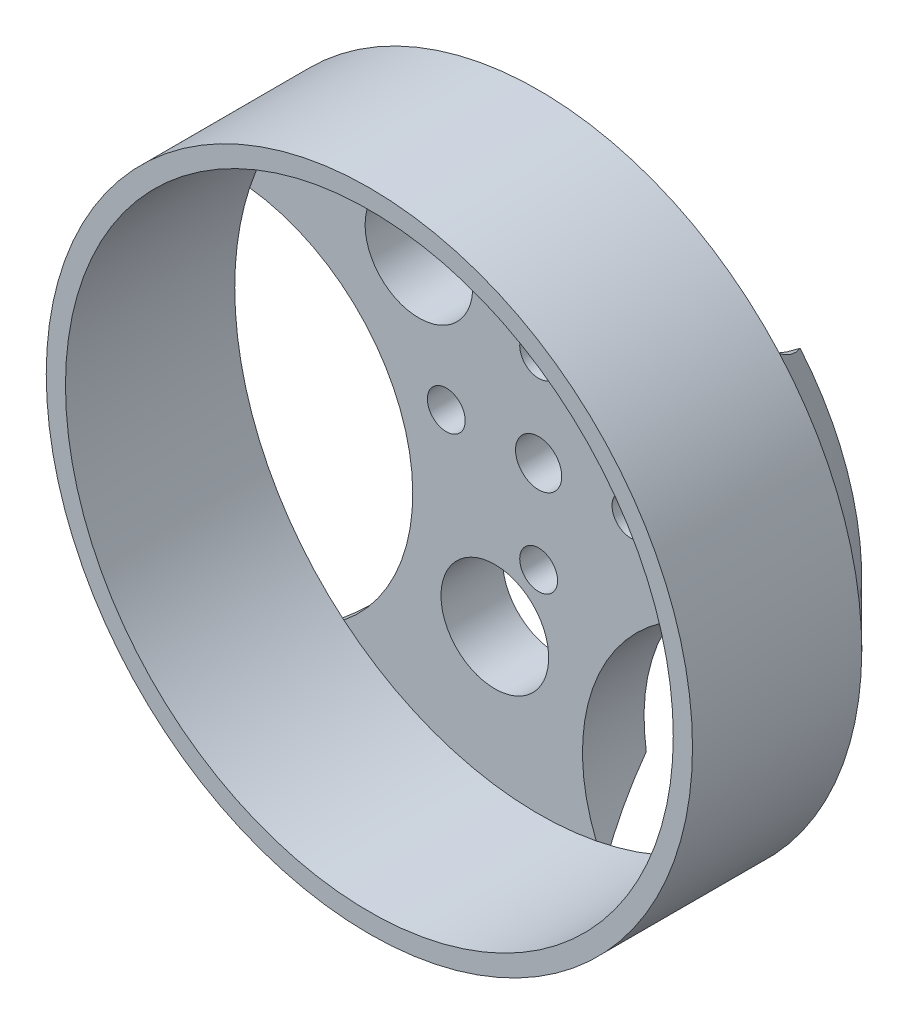
ISO-10303-21;
HEADER;
FILE_DESCRIPTION(('STEP AP214'),'2;1');
FILE_NAME('part.step','',(''),(''),'','','');
FILE_SCHEMA(('AUTOMOTIVE_DESIGN { 1 0 10303 214 1 1 1 1 }'));
ENDSEC;
DATA;
#1=APPLICATION_CONTEXT('core data for automotive mechanical design processes');
#2=APPLICATION_PROTOCOL_DEFINITION('international standard','automotive_design',2000,#1);
#3=PRODUCT_CONTEXT('',#1,'mechanical');
#4=PRODUCT('Part','Part','',(#3));
#5=PRODUCT_RELATED_PRODUCT_CATEGORY('part','',(#4));
#6=PRODUCT_DEFINITION_FORMATION('','',#4);
#7=PRODUCT_DEFINITION_CONTEXT('part definition',#1,'design');
#8=PRODUCT_DEFINITION('design','',#6,#7);
#9=PRODUCT_DEFINITION_SHAPE('','',#8);
#10=(LENGTH_UNIT() NAMED_UNIT(*) SI_UNIT(.MILLI.,.METRE.));
#11=(NAMED_UNIT(*) PLANE_ANGLE_UNIT() SI_UNIT($,.RADIAN.));
#12=(NAMED_UNIT(*) SI_UNIT($,.STERADIAN.) SOLID_ANGLE_UNIT());
#13=UNCERTAINTY_MEASURE_WITH_UNIT(LENGTH_MEASURE(1.E-05),#10,'distance_accuracy_value','');
#14=(GEOMETRIC_REPRESENTATION_CONTEXT(3) GLOBAL_UNCERTAINTY_ASSIGNED_CONTEXT((#13)) GLOBAL_UNIT_ASSIGNED_CONTEXT((#10,
#11,#12)) REPRESENTATION_CONTEXT('',''));
#15=CARTESIAN_POINT('',(0.,0.,0.));
#16=DIRECTION('',(0.,0.,1.));
#17=DIRECTION('',(1.,0.,0.));
#18=AXIS2_PLACEMENT_3D('',#15,#16,#17);
#19=CARTESIAN_POINT('',(164.009459929821,242.498442091416,-11.));
#20=DIRECTION('',(0.,0.,-1.));
#21=DIRECTION('',(-1.,0.,0.));
#22=AXIS2_PLACEMENT_3D('',#19,#20,#21);
#23=PLANE('',#22);
#24=CARTESIAN_POINT('',(164.009459929821,242.498442091416,-11.));
#25=DIRECTION('',(0.,0.,-1.));
#26=DIRECTION('',(-1.,0.,0.));
#27=AXIS2_PLACEMENT_3D('',#24,#25,#26);
#28=CIRCLE('',#27,19.75);
#29=CARTESIAN_POINT('',(151.35141012767,227.338090010866,-11.));
#30=VERTEX_POINT('',#29);
#31=CARTESIAN_POINT('',(167.751872438551,223.106256845434,-11.));
#32=VERTEX_POINT('',#31);
#33=EDGE_CURVE('E92',#30,#32,#28,.F.);
#34=ORIENTED_EDGE('',*,*,#33,.T.);
#35=CARTESIAN_POINT('',(178.858702334738,227.649199686498,-11.));
#36=DIRECTION('',(0.,0.,1.));
#37=DIRECTION('',(1.,0.,0.));
#38=AXIS2_PLACEMENT_3D('',#35,#36,#37);
#39=CIRCLE('',#38,12.);
#40=CARTESIAN_POINT('',(183.401645175803,238.756029582685,-11.));
#41=VERTEX_POINT('',#40);
#42=EDGE_CURVE('E239',#32,#41,#39,.F.);
#43=ORIENTED_EDGE('',*,*,#42,.T.);
#44=CARTESIAN_POINT('',(164.009459929821,242.498442091416,-11.));
#45=DIRECTION('',(0.,0.,-1.));
#46=DIRECTION('',(-1.,0.,0.));
#47=AXIS2_PLACEMENT_3D('',#44,#45,#46);
#48=CIRCLE('',#47,19.75);
#49=CARTESIAN_POINT('',(178.93237873337,255.435559018409,-11.));
#50=VERTEX_POINT('',#49);
#51=EDGE_CURVE('E116',#41,#50,#48,.F.);
#52=ORIENTED_EDGE('',*,*,#51,.T.);
#53=CARTESIAN_POINT('',(169.444659876974,262.782884443487,-11.));
#54=DIRECTION('',(0.,0.,1.));
#55=DIRECTION('',(1.,0.,0.));
#56=AXIS2_PLACEMENT_3D('',#53,#54,#55);
#57=CIRCLE('',#56,12.);
#58=CARTESIAN_POINT('',(157.554391610831,261.163773403696,-11.));
#59=VERTEX_POINT('',#58);
#60=EDGE_CURVE('E244',#50,#59,#57,.F.);
#61=ORIENTED_EDGE('',*,*,#60,.T.);
#62=CARTESIAN_POINT('',(164.009459929821,242.498442091416,-11.));
#63=DIRECTION('',(0.,0.,-1.));
#64=DIRECTION('',(-1.,0.,0.));
#65=AXIS2_PLACEMENT_3D('',#62,#63,#64);
#66=CIRCLE('',#65,19.75);
#67=CARTESIAN_POINT('',(145.227590332982,248.606131871305,-11.));
#68=VERTEX_POINT('',#67);
#69=EDGE_CURVE('E85',#59,#68,#66,.F.);
#70=ORIENTED_EDGE('',*,*,#69,.T.);
#71=CARTESIAN_POINT('',(143.829338827367,236.687873075363,-11.));
#72=DIRECTION('',(0.,0.,1.));
#73=DIRECTION('',(1.,0.,0.));
#74=AXIS2_PLACEMENT_3D('',#71,#72,#73);
#75=CIRCLE('',#74,12.);
#76=EDGE_CURVE('E88',#68,#30,#75,.F.);
#77=ORIENTED_EDGE('',*,*,#76,.T.);
#78=EDGE_LOOP('',(#34,#43,#52,#61,#70,#77));
#79=FACE_BOUND('',#78,.T.);
#80=CARTESIAN_POINT('',(164.009459929821,242.498442091416,-11.));
#81=DIRECTION('',(0.,0.,-1.));
#82=DIRECTION('',(-1.,0.,0.));
#83=AXIS2_PLACEMENT_3D('',#80,#81,#82);
#84=CIRCLE('',#83,1.5);
#85=CARTESIAN_POINT('',(162.509459929821,242.498442091416,-11.));
#86=VERTEX_POINT('',#85);
#87=EDGE_CURVE('E96',#86,#86,#84,.T.);
#88=ORIENTED_EDGE('',*,*,#87,.T.);
#89=EDGE_LOOP('',(#88));
#90=FACE_BOUND('',#89,.T.);
#91=CARTESIAN_POINT('',(156.231285336769,250.276616684468,-11.));
#92=DIRECTION('',(0.,0.,-1.));
#93=DIRECTION('',(-1.,0.,0.));
#94=AXIS2_PLACEMENT_3D('',#91,#92,#93);
#95=CIRCLE('',#94,3.5);
#96=CARTESIAN_POINT('',(152.731285336769,250.276616684468,-11.));
#97=VERTEX_POINT('',#96);
#98=EDGE_CURVE('E252',#97,#97,#95,.T.);
#99=ORIENTED_EDGE('',*,*,#98,.T.);
#100=EDGE_LOOP('',(#99));
#101=FACE_BOUND('',#100,.T.);
#102=CARTESIAN_POINT('',(174.634644019,245.345451587544,-11.));
#103=DIRECTION('',(0.,0.,-1.));
#104=DIRECTION('',(-1.,0.,0.));
#105=AXIS2_PLACEMENT_3D('',#102,#103,#104);
#106=CIRCLE('',#105,3.5);
#107=CARTESIAN_POINT('',(171.134644019,245.345451587544,-11.));
#108=VERTEX_POINT('',#107);
#109=EDGE_CURVE('E255',#108,#108,#106,.T.);
#110=ORIENTED_EDGE('',*,*,#109,.T.);
#111=EDGE_LOOP('',(#110));
#112=FACE_BOUND('',#111,.T.);
#113=CARTESIAN_POINT('',(161.162450433693,231.873258002237,-11.));
#114=DIRECTION('',(0.,0.,-1.));
#115=DIRECTION('',(-1.,0.,0.));
#116=AXIS2_PLACEMENT_3D('',#113,#114,#115);
#117=CIRCLE('',#116,3.5);
#118=CARTESIAN_POINT('',(157.662450433693,231.873258002237,-11.));
#119=VERTEX_POINT('',#118);
#120=EDGE_CURVE('E258',#119,#119,#117,.T.);
#121=ORIENTED_EDGE('',*,*,#120,.T.);
#122=EDGE_LOOP('',(#121));
#123=FACE_BOUND('',#122,.T.);
#124=CARTESIAN_POINT('',(164.009459929821,236.498442091416,-11.));
#125=DIRECTION('',(0.,0.,-1.));
#126=DIRECTION('',(-1.,0.,0.));
#127=AXIS2_PLACEMENT_3D('',#124,#125,#126);
#128=CIRCLE('',#127,1.2295);
#129=CARTESIAN_POINT('',(162.779959929821,236.498442091416,-11.));
#130=VERTEX_POINT('',#129);
#131=EDGE_CURVE('E261',#130,#130,#128,.T.);
#132=ORIENTED_EDGE('',*,*,#131,.T.);
#133=EDGE_LOOP('',(#132));
#134=FACE_BOUND('',#133,.T.);
#135=CARTESIAN_POINT('',(158.009459929821,242.498442091416,-11.));
#136=DIRECTION('',(0.,0.,-1.));
#137=DIRECTION('',(-1.,0.,0.));
#138=AXIS2_PLACEMENT_3D('',#135,#136,#137);
#139=CIRCLE('',#138,1.2295);
#140=CARTESIAN_POINT('',(156.779959929821,242.498442091416,-11.));
#141=VERTEX_POINT('',#140);
#142=EDGE_CURVE('E264',#141,#141,#139,.T.);
#143=ORIENTED_EDGE('',*,*,#142,.T.);
#144=EDGE_LOOP('',(#143));
#145=FACE_BOUND('',#144,.T.);
#146=CARTESIAN_POINT('',(164.009459929821,248.498442091416,-11.));
#147=DIRECTION('',(0.,0.,-1.));
#148=DIRECTION('',(-1.,0.,0.));
#149=AXIS2_PLACEMENT_3D('',#146,#147,#148);
#150=CIRCLE('',#149,1.2295);
#151=CARTESIAN_POINT('',(162.779959929821,248.498442091416,-11.));
#152=VERTEX_POINT('',#151);
#153=EDGE_CURVE('E266',#152,#152,#150,.T.);
#154=ORIENTED_EDGE('',*,*,#153,.T.);
#155=EDGE_LOOP('',(#154));
#156=FACE_BOUND('',#155,.T.);
#157=CARTESIAN_POINT('',(170.009459929821,242.498442091416,-11.));
#158=DIRECTION('',(0.,0.,-1.));
#159=DIRECTION('',(-1.,0.,0.));
#160=AXIS2_PLACEMENT_3D('',#157,#158,#159);
#161=CIRCLE('',#160,1.2295);
#162=CARTESIAN_POINT('',(168.779959929821,242.498442091416,-11.));
#163=VERTEX_POINT('',#162);
#164=EDGE_CURVE('E20',#163,#163,#161,.T.);
#165=ORIENTED_EDGE('',*,*,#164,.T.);
#166=EDGE_LOOP('',(#165));
#167=FACE_BOUND('',#166,.T.);
#168=ADVANCED_FACE('F17',(#79,#90,#101,#112,#123,#134,#145,#156,#167),#23,.F.);
#169=CARTESIAN_POINT('',(170.009459929821,242.498442091416,-15.));
#170=DIRECTION('',(0.,0.,-1.));
#171=DIRECTION('',(-1.,0.,0.));
#172=AXIS2_PLACEMENT_3D('',#169,#170,#171);
#173=CYLINDRICAL_SURFACE('',#172,1.2295);
#174=ORIENTED_EDGE('',*,*,#164,.F.);
#175=EDGE_LOOP('',(#174));
#176=FACE_BOUND('',#175,.T.);
#177=CARTESIAN_POINT('',(170.009459929821,242.498442091416,-15.));
#178=DIRECTION('',(0.,0.,-1.));
#179=DIRECTION('',(-1.,0.,0.));
#180=AXIS2_PLACEMENT_3D('',#177,#178,#179);
#181=CIRCLE('',#180,1.2295);
#182=CARTESIAN_POINT('',(168.779959929821,242.498442091416,-15.));
#183=VERTEX_POINT('',#182);
#184=EDGE_CURVE('E280',#183,#183,#181,.F.);
#185=ORIENTED_EDGE('',*,*,#184,.F.);
#186=EDGE_LOOP('',(#185));
#187=FACE_BOUND('',#186,.T.);
#188=ADVANCED_FACE('F274',(#176,#187),#173,.F.);
#189=CARTESIAN_POINT('',(164.009459929821,248.498442091416,-15.));
#190=DIRECTION('',(0.,0.,-1.));
#191=DIRECTION('',(-1.,0.,0.));
#192=AXIS2_PLACEMENT_3D('',#189,#190,#191);
#193=CYLINDRICAL_SURFACE('',#192,1.2295);
#194=ORIENTED_EDGE('',*,*,#153,.F.);
#195=EDGE_LOOP('',(#194));
#196=FACE_BOUND('',#195,.T.);
#197=CARTESIAN_POINT('',(164.009459929821,248.498442091416,-15.));
#198=DIRECTION('',(0.,0.,-1.));
#199=DIRECTION('',(-1.,0.,0.));
#200=AXIS2_PLACEMENT_3D('',#197,#198,#199);
#201=CIRCLE('',#200,1.2295);
#202=CARTESIAN_POINT('',(162.779959929821,248.498442091416,-15.));
#203=VERTEX_POINT('',#202);
#204=EDGE_CURVE('E282',#203,#203,#201,.F.);
#205=ORIENTED_EDGE('',*,*,#204,.F.);
#206=EDGE_LOOP('',(#205));
#207=FACE_BOUND('',#206,.T.);
#208=ADVANCED_FACE('F277',(#196,#207),#193,.F.);
#209=CARTESIAN_POINT('',(158.009459929821,242.498442091416,-15.));
#210=DIRECTION('',(0.,0.,-1.));
#211=DIRECTION('',(-1.,0.,0.));
#212=AXIS2_PLACEMENT_3D('',#209,#210,#211);
#213=CYLINDRICAL_SURFACE('',#212,1.2295);
#214=ORIENTED_EDGE('',*,*,#142,.F.);
#215=EDGE_LOOP('',(#214));
#216=FACE_BOUND('',#215,.T.);
#217=CARTESIAN_POINT('',(158.009459929821,242.498442091416,-15.));
#218=DIRECTION('',(0.,0.,-1.));
#219=DIRECTION('',(-1.,0.,0.));
#220=AXIS2_PLACEMENT_3D('',#217,#218,#219);
#221=CIRCLE('',#220,1.2295);
#222=CARTESIAN_POINT('',(156.779959929821,242.498442091416,-15.));
#223=VERTEX_POINT('',#222);
#224=EDGE_CURVE('E285',#223,#223,#221,.F.);
#225=ORIENTED_EDGE('',*,*,#224,.F.);
#226=EDGE_LOOP('',(#225));
#227=FACE_BOUND('',#226,.T.);
#228=ADVANCED_FACE('F446',(#216,#227),#213,.F.);
#229=CARTESIAN_POINT('',(164.009459929821,236.498442091416,-15.));
#230=DIRECTION('',(0.,0.,-1.));
#231=DIRECTION('',(-1.,0.,0.));
#232=AXIS2_PLACEMENT_3D('',#229,#230,#231);
#233=CYLINDRICAL_SURFACE('',#232,1.2295);
#234=ORIENTED_EDGE('',*,*,#131,.F.);
#235=EDGE_LOOP('',(#234));
#236=FACE_BOUND('',#235,.T.);
#237=CARTESIAN_POINT('',(164.009459929821,236.498442091416,-15.));
#238=DIRECTION('',(0.,0.,-1.));
#239=DIRECTION('',(-1.,0.,0.));
#240=AXIS2_PLACEMENT_3D('',#237,#238,#239);
#241=CIRCLE('',#240,1.2295);
#242=CARTESIAN_POINT('',(162.779959929821,236.498442091416,-15.));
#243=VERTEX_POINT('',#242);
#244=EDGE_CURVE('E290',#243,#243,#241,.F.);
#245=ORIENTED_EDGE('',*,*,#244,.F.);
#246=EDGE_LOOP('',(#245));
#247=FACE_BOUND('',#246,.T.);
#248=ADVANCED_FACE('F436',(#236,#247),#233,.F.);
#249=CARTESIAN_POINT('',(161.162450433693,231.873258002237,-15.));
#250=DIRECTION('',(0.,0.,-1.));
#251=DIRECTION('',(-1.,0.,0.));
#252=AXIS2_PLACEMENT_3D('',#249,#250,#251);
#253=CYLINDRICAL_SURFACE('',#252,3.5);
#254=ORIENTED_EDGE('',*,*,#120,.F.);
#255=EDGE_LOOP('',(#254));
#256=FACE_BOUND('',#255,.T.);
#257=CARTESIAN_POINT('',(161.162450433693,231.873258002237,-15.));
#258=DIRECTION('',(0.,0.,-1.));
#259=DIRECTION('',(-1.,0.,0.));
#260=AXIS2_PLACEMENT_3D('',#257,#258,#259);
#261=CIRCLE('',#260,3.5);
#262=CARTESIAN_POINT('',(157.662450433693,231.873258002237,-15.));
#263=VERTEX_POINT('',#262);
#264=EDGE_CURVE('E293',#263,#263,#261,.F.);
#265=ORIENTED_EDGE('',*,*,#264,.F.);
#266=EDGE_LOOP('',(#265));
#267=FACE_BOUND('',#266,.T.);
#268=ADVANCED_FACE('F426',(#256,#267),#253,.F.);
#269=CARTESIAN_POINT('',(174.634644019,245.345451587544,-15.));
#270=DIRECTION('',(0.,0.,-1.));
#271=DIRECTION('',(-1.,0.,0.));
#272=AXIS2_PLACEMENT_3D('',#269,#270,#271);
#273=CYLINDRICAL_SURFACE('',#272,3.5);
#274=ORIENTED_EDGE('',*,*,#109,.F.);
#275=EDGE_LOOP('',(#274));
#276=FACE_BOUND('',#275,.T.);
#277=CARTESIAN_POINT('',(174.634644019,245.345451587544,-15.));
#278=DIRECTION('',(0.,0.,-1.));
#279=DIRECTION('',(-1.,0.,0.));
#280=AXIS2_PLACEMENT_3D('',#277,#278,#279);
#281=CIRCLE('',#280,3.5);
#282=CARTESIAN_POINT('',(171.134644019,245.345451587544,-15.));
#283=VERTEX_POINT('',#282);
#284=EDGE_CURVE('E296',#283,#283,#281,.F.);
#285=ORIENTED_EDGE('',*,*,#284,.F.);
#286=EDGE_LOOP('',(#285));
#287=FACE_BOUND('',#286,.T.);
#288=ADVANCED_FACE('F416',(#276,#287),#273,.F.);
#289=CARTESIAN_POINT('',(156.231285336769,250.276616684468,-15.));
#290=DIRECTION('',(0.,0.,-1.));
#291=DIRECTION('',(-1.,0.,0.));
#292=AXIS2_PLACEMENT_3D('',#289,#290,#291);
#293=CYLINDRICAL_SURFACE('',#292,3.5);
#294=ORIENTED_EDGE('',*,*,#98,.F.);
#295=EDGE_LOOP('',(#294));
#296=FACE_BOUND('',#295,.T.);
#297=CARTESIAN_POINT('',(156.231285336769,250.276616684468,-15.));
#298=DIRECTION('',(0.,0.,-1.));
#299=DIRECTION('',(-1.,0.,0.));
#300=AXIS2_PLACEMENT_3D('',#297,#298,#299);
#301=CIRCLE('',#300,3.5);
#302=CARTESIAN_POINT('',(152.731285336769,250.276616684468,-15.));
#303=VERTEX_POINT('',#302);
#304=EDGE_CURVE('E299',#303,#303,#301,.F.);
#305=ORIENTED_EDGE('',*,*,#304,.F.);
#306=EDGE_LOOP('',(#305));
#307=FACE_BOUND('',#306,.T.);
#308=ADVANCED_FACE('F406',(#296,#307),#293,.F.);
#309=CARTESIAN_POINT('',(164.009459929821,242.498442091416,-15.));
#310=DIRECTION('',(0.,0.,-1.));
#311=DIRECTION('',(-1.,0.,0.));
#312=AXIS2_PLACEMENT_3D('',#309,#310,#311);
#313=CYLINDRICAL_SURFACE('',#312,1.5);
#314=ORIENTED_EDGE('',*,*,#87,.F.);
#315=EDGE_LOOP('',(#314));
#316=FACE_BOUND('',#315,.T.);
#317=CARTESIAN_POINT('',(164.009459929821,242.498442091416,-15.));
#318=DIRECTION('',(0.,0.,-1.));
#319=DIRECTION('',(-1.,0.,0.));
#320=AXIS2_PLACEMENT_3D('',#317,#318,#319);
#321=CIRCLE('',#320,1.5);
#322=CARTESIAN_POINT('',(162.509459929821,242.498442091416,-15.));
#323=VERTEX_POINT('',#322);
#324=EDGE_CURVE('E302',#323,#323,#321,.F.);
#325=ORIENTED_EDGE('',*,*,#324,.F.);
#326=EDGE_LOOP('',(#325));
#327=FACE_BOUND('',#326,.T.);
#328=ADVANCED_FACE('F398',(#316,#327),#313,.F.);
#329=CARTESIAN_POINT('',(143.829338827367,236.687873075363,-11.));
#330=DIRECTION('',(0.,0.,1.));
#331=DIRECTION('',(1.,0.,0.));
#332=AXIS2_PLACEMENT_3D('',#329,#330,#331);
#333=CYLINDRICAL_SURFACE('',#332,12.);
#334=CARTESIAN_POINT('',(147.914440258764,247.971132635224,-14.9999999999998));
#335=CARTESIAN_POINT('',(147.598248443862,248.085583475005,-14.6637375180225));
#336=CARTESIAN_POINT('',(147.277329831631,248.186764558465,-14.3273871770296));
#337=CARTESIAN_POINT('',(146.628483037545,248.361665984288,-13.6567511009477));
#338=CARTESIAN_POINT('',(146.300584481524,248.435484539605,-13.322462301479));
#339=CARTESIAN_POINT('',(145.637902187357,248.555579411234,-12.6557280684694));
#340=CARTESIAN_POINT('',(145.303118264568,248.601854987937,-12.3232826846671));
#341=CARTESIAN_POINT('',(144.626934804474,248.666167210587,-11.6599382837679));
#342=CARTESIAN_POINT('',(144.28551562848,248.68410049742,-11.3290492941453));
#343=CARTESIAN_POINT('',(143.942135585029,248.68734293413,-10.9999999999997));
#344=B_SPLINE_CURVE_WITH_KNOTS('',3,(#334,#335,#336,#337,#338,#339,#340,#341,#342,#343),
.UNSPECIFIED.,.F.,.F.,(4,2,2,2,4),(0.,1.42646001456949,2.84774925299173,4.26907665546553,
5.69557551478483),.UNSPECIFIED.);
#345=CARTESIAN_POINT('',(147.914440258764,247.971132635224,-14.9999999999999));
#346=VERTEX_POINT('',#345);
#347=CARTESIAN_POINT('',(143.942135585029,248.68734293413,-11.));
#348=VERTEX_POINT('',#347);
#349=EDGE_CURVE('E135',#346,#348,#344,.T.);
#350=ORIENTED_EDGE('',*,*,#349,.F.);
#351=CARTESIAN_POINT('',(143.829338827367,236.687873075363,-15.));
#352=DIRECTION('',(0.,0.,1.));
#353=DIRECTION('',(1.,0.,0.));
#354=AXIS2_PLACEMENT_3D('',#351,#352,#353);
#355=CIRCLE('',#354,12.);
#356=CARTESIAN_POINT('',(153.289171287867,229.304677979792,-15.0000000000001));
#357=VERTEX_POINT('',#356);
#358=EDGE_CURVE('E305',#357,#346,#355,.T.);
#359=ORIENTED_EDGE('',*,*,#358,.F.);
#360=CARTESIAN_POINT('',(150.305969368466,226.585731874899,-11.0000000000001));
#361=CARTESIAN_POINT('',(150.595047175122,226.771081245911,-11.3290492941458));
#362=CARTESIAN_POINT('',(150.874652026793,226.967829266067,-11.6599382837683));
#363=CARTESIAN_POINT('',(151.413098936553,227.381876436154,-12.3232826846675));
#364=CARTESIAN_POINT('',(151.67201259082,227.599098496708,-12.6557280684698));
#365=CARTESIAN_POINT('',(152.169361395354,228.053207258816,-13.3224623014794));
#366=CARTESIAN_POINT('',(152.407797095301,228.290093432198,-13.6567511009481));
#367=CARTESIAN_POINT('',(152.864283723207,228.78325935711,-14.32738717703));
#368=CARTESIAN_POINT('',(153.082257333698,229.039606528844,-14.6637375180229));
#369=CARTESIAN_POINT('',(153.289171287867,229.304677979792,-15.0000000000003));
#370=B_SPLINE_CURVE_WITH_KNOTS('',3,(#360,#361,#362,#363,#364,#365,#366,#367,#368,#369),
.UNSPECIFIED.,.F.,.F.,(4,2,2,2,4),(0.,1.42649885931931,2.84782626179306,4.26911550021528,
5.69557551478477),.UNSPECIFIED.);
#371=CARTESIAN_POINT('',(150.305969368466,226.585731874899,-11.));
#372=VERTEX_POINT('',#371);
#373=EDGE_CURVE('E102',#372,#357,#370,.T.);
#374=ORIENTED_EDGE('',*,*,#373,.F.);
#375=CARTESIAN_POINT('',(143.829338827367,236.687873075363,-11.));
#376=DIRECTION('',(0.,0.,1.));
#377=DIRECTION('',(1.,0.,0.));
#378=AXIS2_PLACEMENT_3D('',#375,#376,#377);
#379=CIRCLE('',#378,12.);
#380=EDGE_CURVE('E99',#372,#30,#379,.T.);
#381=ORIENTED_EDGE('',*,*,#380,.T.);
#382=ORIENTED_EDGE('',*,*,#76,.F.);
#383=CARTESIAN_POINT('',(143.829338827367,236.687873075363,-11.));
#384=DIRECTION('',(0.,0.,1.));
#385=DIRECTION('',(1.,0.,0.));
#386=AXIS2_PLACEMENT_3D('',#383,#384,#385);
#387=CIRCLE('',#386,12.);
#388=EDGE_CURVE('E119',#68,#348,#387,.T.);
#389=ORIENTED_EDGE('',*,*,#388,.T.);
#390=EDGE_LOOP('',(#350,#359,#374,#381,#382,#389));
#391=FACE_BOUND('',#390,.T.);
#392=ADVANCED_FACE('F100',(#391),#333,.F.);
#393=CARTESIAN_POINT('',(164.009459929821,242.498442091416,-11.));
#394=DIRECTION('',(0.,0.,-1.));
#395=DIRECTION('',(-1.,0.,0.));
#396=AXIS2_PLACEMENT_3D('',#393,#394,#395);
#397=CYLINDRICAL_SURFACE('',#396,19.75);
#398=CARTESIAN_POINT('',(164.009459929821,242.498442091416,0.));
#399=DIRECTION('',(0.,0.,-1.));
#400=DIRECTION('',(-1.,0.,0.));
#401=AXIS2_PLACEMENT_3D('',#398,#399,#400);
#402=CIRCLE('',#401,19.75);
#403=CARTESIAN_POINT('',(144.259459929821,242.498442091416,0.));
#404=VERTEX_POINT('',#403);
#405=EDGE_CURVE('E314',#404,#404,#402,.F.);
#406=ORIENTED_EDGE('',*,*,#405,.T.);
#407=EDGE_LOOP('',(#406));
#408=FACE_BOUND('',#407,.T.);
#409=ORIENTED_EDGE('',*,*,#51,.F.);
#410=CARTESIAN_POINT('',(164.009459929821,242.498442091416,-11.));
#411=DIRECTION('',(0.,0.,-1.));
#412=DIRECTION('',(-1.,0.,0.));
#413=AXIS2_PLACEMENT_3D('',#410,#411,#412);
#414=CIRCLE('',#413,19.75);
#415=EDGE_CURVE('E114',#41,#32,#414,.T.);
#416=ORIENTED_EDGE('',*,*,#415,.T.);
#417=ORIENTED_EDGE('',*,*,#33,.F.);
#418=CARTESIAN_POINT('',(164.009459929821,242.498442091416,-11.));
#419=DIRECTION('',(0.,0.,-1.));
#420=DIRECTION('',(-1.,0.,0.));
#421=AXIS2_PLACEMENT_3D('',#418,#419,#420);
#422=CIRCLE('',#421,19.75);
#423=EDGE_CURVE('E107',#30,#68,#422,.T.);
#424=ORIENTED_EDGE('',*,*,#423,.T.);
#425=ORIENTED_EDGE('',*,*,#69,.F.);
#426=CARTESIAN_POINT('',(164.009459929821,242.498442091416,-11.));
#427=DIRECTION('',(0.,0.,-1.));
#428=DIRECTION('',(-1.,0.,0.));
#429=AXIS2_PLACEMENT_3D('',#426,#427,#428);
#430=CIRCLE('',#429,19.75);
#431=EDGE_CURVE('E242',#59,#50,#430,.T.);
#432=ORIENTED_EDGE('',*,*,#431,.T.);
#433=EDGE_LOOP('',(#409,#416,#417,#424,#425,#432));
#434=FACE_BOUND('',#433,.T.);
#435=ADVANCED_FACE('F112',(#408,#434),#397,.F.);
#436=CARTESIAN_POINT('',(169.444659876974,262.782884443487,-11.));
#437=DIRECTION('',(0.,0.,1.));
#438=DIRECTION('',(1.,0.,0.));
#439=AXIS2_PLACEMENT_3D('',#436,#437,#438);
#440=CYLINDRICAL_SURFACE('',#439,12.);
#441=CARTESIAN_POINT('',(157.449347562768,262.447500358203,-10.9999999999998));
#442=CARTESIAN_POINT('',(157.458959615549,262.10423955928,-11.3290492941454));
#443=CARTESIAN_POINT('',(157.48322361348,261.763211825924,-11.6599382837679));
#444=CARTESIAN_POINT('',(157.560068905631,261.088337811933,-12.3232826846671));
#445=CARTESIAN_POINT('',(157.612547222848,260.754469978532,-12.6557280684693));
#446=CARTESIAN_POINT('',(157.744915098972,260.094129652212,-13.3224623014789));
#447=CARTESIAN_POINT('',(157.824803921823,259.767656960961,-13.6567511009477));
#448=CARTESIAN_POINT('',(158.011712252754,259.122166491024,-14.3273871770295));
#449=CARTESIAN_POINT('',(158.118829407287,258.803180155061,-14.6637375180224));
#450=CARTESIAN_POINT('',(158.239126345906,258.489165975292,-14.9999999999998));
#451=B_SPLINE_CURVE_WITH_KNOTS('',3,(#441,#442,#443,#444,#445,#446,#447,#448,#449,#450),
.UNSPECIFIED.,.F.,.F.,(4,2,2,2,4),(0.,1.42649885931924,2.84782626179297,4.26911550021517,
5.69557551478456),.UNSPECIFIED.);
#452=CARTESIAN_POINT('',(157.449347562768,262.447500358203,-10.9999999999999));
#453=VERTEX_POINT('',#452);
#454=CARTESIAN_POINT('',(158.239126345906,258.489165975292,-14.9999999999999));
#455=VERTEX_POINT('',#454);
#456=EDGE_CURVE('E127',#453,#455,#451,.T.);
#457=ORIENTED_EDGE('',*,*,#456,.F.);
#458=CARTESIAN_POINT('',(169.444659876974,262.782884443487,-11.));
#459=DIRECTION('',(0.,0.,1.));
#460=DIRECTION('',(1.,0.,0.));
#461=AXIS2_PLACEMENT_3D('',#458,#459,#460);
#462=CIRCLE('',#461,12.);
#463=EDGE_CURVE('E317',#453,#59,#462,.T.);
#464=ORIENTED_EDGE('',*,*,#463,.T.);
#465=ORIENTED_EDGE('',*,*,#60,.F.);
#466=CARTESIAN_POINT('',(169.444659876974,262.782884443487,-11.));
#467=DIRECTION('',(0.,0.,1.));
#468=DIRECTION('',(1.,0.,0.));
#469=AXIS2_PLACEMENT_3D('',#466,#467,#468);
#470=CIRCLE('',#469,12.);
#471=CARTESIAN_POINT('',(179.665213024762,256.494777148503,-11.));
#472=VERTEX_POINT('',#471);
#473=EDGE_CURVE('E320',#50,#472,#470,.T.);
#474=ORIENTED_EDGE('',*,*,#473,.T.);
#475=CARTESIAN_POINT('',(177.002077343739,253.461648407798,-15.));
#476=CARTESIAN_POINT('',(177.263264638466,253.673444195317,-14.6637375180226));
#477=CARTESIAN_POINT('',(177.515523983454,253.896135888454,-14.3273871770297));
#478=CARTESIAN_POINT('',(178.000136581188,254.361692867855,-13.6567511009478));
#479=CARTESIAN_POINT('',(178.23255867688,254.604482100695,-13.3224623014791));
#480=CARTESIAN_POINT('',(178.677362783409,255.110169660369,-12.6557280684695));
#481=CARTESIAN_POINT('',(178.889744255967,255.373068526992,-12.3232826846672));
#482=CARTESIAN_POINT('',(179.293731238127,255.919103921387,-11.659938283768));
#483=CARTESIAN_POINT('',(179.48525834341,256.202310602903,-11.3290492941455));
#484=CARTESIAN_POINT('',(179.665213024762,256.494777148503,-10.9999999999999));
#485=B_SPLINE_CURVE_WITH_KNOTS('',3,(#475,#476,#477,#478,#479,#480,#481,#482,#483,#484),
.UNSPECIFIED.,.F.,.F.,(4,2,2,2,4),(0.,1.42646001456949,2.84774925299172,4.26907665546548,
5.69557551478472),.UNSPECIFIED.);
#486=CARTESIAN_POINT('',(177.002077343739,253.461648407798,-15.));
#487=VERTEX_POINT('',#486);
#488=EDGE_CURVE('E200',#487,#472,#485,.T.);
#489=ORIENTED_EDGE('',*,*,#488,.F.);
#490=CARTESIAN_POINT('',(169.444659876974,262.782884443487,-15.));
#491=DIRECTION('',(0.,0.,1.));
#492=DIRECTION('',(1.,0.,0.));
#493=AXIS2_PLACEMENT_3D('',#490,#491,#492);
#494=CIRCLE('',#493,12.);
#495=EDGE_CURVE('E308',#455,#487,#494,.T.);
#496=ORIENTED_EDGE('',*,*,#495,.F.);
#497=EDGE_LOOP('',(#457,#464,#465,#474,#489,#496));
#498=FACE_BOUND('',#497,.T.);
#499=ADVANCED_FACE('F141',(#498),#440,.F.);
#500=CARTESIAN_POINT('',(178.858702334738,227.649199686498,-11.));
#501=DIRECTION('',(0.,0.,1.));
#502=DIRECTION('',(1.,0.,0.));
#503=AXIS2_PLACEMENT_3D('',#500,#501,#502);
#504=CYLINDRICAL_SURFACE('',#503,12.);
#505=CARTESIAN_POINT('',(184.56590735396,238.205136919571,-11.0000000000002));
#506=CARTESIAN_POINT('',(184.263828755579,238.368443037141,-11.3290492941458));
#507=CARTESIAN_POINT('',(183.956358076133,238.517943665213,-11.6599382837683));
#508=CARTESIAN_POINT('',(183.333477389587,238.788830697046,-12.3232826846675));
#509=CARTESIAN_POINT('',(183.018100205747,238.910317057888,-12.6557280684697));
#510=CARTESIAN_POINT('',(182.380044769948,239.125853277679,-13.3224623014793));
#511=CARTESIAN_POINT('',(182.057366714258,239.219903873238,-13.656751100948));
#512=CARTESIAN_POINT('',(181.404901403926,239.380781745441,-14.3273871770299));
#513=CARTESIAN_POINT('',(181.075092556256,239.447508736416,-14.6637375180228));
#514=CARTESIAN_POINT('',(180.742999830117,239.500335621458,-15.0000000000001));
#515=B_SPLINE_CURVE_WITH_KNOTS('',3,(#505,#506,#507,#508,#509,#510,#511,#512,#513,#514),
.UNSPECIFIED.,.F.,.F.,(4,2,2,2,4),(0.,1.42649885931921,2.8478262617929,4.26911550021507,
5.69557551478442),.UNSPECIFIED.);
#516=CARTESIAN_POINT('',(184.56590735396,238.205136919571,-11.0000000000001));
#517=VERTEX_POINT('',#516);
#518=CARTESIAN_POINT('',(180.742999830117,239.500335621458,-15.));
#519=VERTEX_POINT('',#518);
#520=EDGE_CURVE('E35',#517,#519,#515,.T.);
#521=ORIENTED_EDGE('',*,*,#520,.F.);
#522=CARTESIAN_POINT('',(178.858702334738,227.649199686498,-11.));
#523=DIRECTION('',(0.,0.,1.));
#524=DIRECTION('',(1.,0.,0.));
#525=AXIS2_PLACEMENT_3D('',#522,#523,#524);
#526=CIRCLE('',#525,12.);
#527=EDGE_CURVE('E209',#517,#41,#526,.T.);
#528=ORIENTED_EDGE('',*,*,#527,.T.);
#529=ORIENTED_EDGE('',*,*,#42,.F.);
#530=CARTESIAN_POINT('',(178.858702334738,227.649199686498,-11.));
#531=DIRECTION('',(0.,0.,1.));
#532=DIRECTION('',(1.,0.,0.));
#533=AXIS2_PLACEMENT_3D('',#530,#531,#532);
#534=CIRCLE('',#533,12.);
#535=CARTESIAN_POINT('',(168.302765101666,221.941994667277,-11.));
#536=VERTEX_POINT('',#535);
#537=EDGE_CURVE('E206',#32,#536,#534,.T.);
#538=ORIENTED_EDGE('',*,*,#537,.T.);
#539=CARTESIAN_POINT('',(167.007566399778,225.76490219112,-15.0000000000001));
#540=CARTESIAN_POINT('',(167.06039328482,225.432809464981,-14.6637375180228));
#541=CARTESIAN_POINT('',(167.127120275795,225.103000617311,-14.3273871770299));
#542=CARTESIAN_POINT('',(167.287998147998,224.450535306979,-13.656751100948));
#543=CARTESIAN_POINT('',(167.382048743557,224.127857251288,-13.3224623014793));
#544=CARTESIAN_POINT('',(167.597584963348,223.48980181549,-12.6557280684697));
#545=CARTESIAN_POINT('',(167.71907132419,223.17442463165,-12.3232826846674));
#546=CARTESIAN_POINT('',(167.989958356022,222.551543945104,-11.6599382837682));
#547=CARTESIAN_POINT('',(168.139458984095,222.244073265657,-11.3290492941456));
#548=CARTESIAN_POINT('',(168.302765101665,221.941994667276,-11.));
#549=B_SPLINE_CURVE_WITH_KNOTS('',3,(#539,#540,#541,#542,#543,#544,#545,#546,#547,#548),
.UNSPECIFIED.,.F.,.F.,(4,2,2,2,4),(0.,1.42646001456951,2.84774925299172,4.26907665546553,
5.69557551478486),.UNSPECIFIED.);
#550=CARTESIAN_POINT('',(167.007566399778,225.76490219112,-15.0000000000001));
#551=VERTEX_POINT('',#550);
#552=EDGE_CURVE('E121',#551,#536,#549,.T.);
#553=ORIENTED_EDGE('',*,*,#552,.F.);
#554=CARTESIAN_POINT('',(178.858702334738,227.649199686498,-15.));
#555=DIRECTION('',(0.,0.,1.));
#556=DIRECTION('',(1.,0.,0.));
#557=AXIS2_PLACEMENT_3D('',#554,#555,#556);
#558=CIRCLE('',#557,12.);
#559=EDGE_CURVE('E311',#519,#551,#558,.T.);
#560=ORIENTED_EDGE('',*,*,#559,.F.);
#561=EDGE_LOOP('',(#521,#528,#529,#538,#553,#560));
#562=FACE_BOUND('',#561,.T.);
#563=ADVANCED_FACE('F163',(#562),#504,.F.);
#564=CARTESIAN_POINT('',(164.009459929821,242.498442091416,-15.));
#565=DIRECTION('',(0.,0.,-1.));
#566=DIRECTION('',(-1.,0.,0.));
#567=AXIS2_PLACEMENT_3D('',#564,#565,#566);
#568=PLANE('',#567);
#569=ORIENTED_EDGE('',*,*,#559,.T.);
#570=CARTESIAN_POINT('',(164.009459929821,242.498442091416,-15.0000000000002));
#571=DIRECTION('',(0.,0.,1.));
#572=DIRECTION('',(1.,0.,0.));
#573=AXIS2_PLACEMENT_3D('',#570,#571,#572);
#574=CIRCLE('',#573,16.9999999999998);
#575=EDGE_CURVE('E210',#357,#551,#574,.T.);
#576=ORIENTED_EDGE('',*,*,#575,.F.);
#577=ORIENTED_EDGE('',*,*,#358,.T.);
#578=CARTESIAN_POINT('',(164.009459929821,242.498442091416,-14.9999999999997));
#579=DIRECTION('',(0.,0.,1.));
#580=DIRECTION('',(1.,0.,0.));
#581=AXIS2_PLACEMENT_3D('',#578,#579,#580);
#582=CIRCLE('',#581,17.0000000000003);
#583=EDGE_CURVE('E108',#455,#346,#582,.T.);
#584=ORIENTED_EDGE('',*,*,#583,.F.);
#585=ORIENTED_EDGE('',*,*,#495,.T.);
#586=CARTESIAN_POINT('',(164.009459929821,242.498442091416,-15.0000000000001));
#587=DIRECTION('',(0.,0.,1.));
#588=DIRECTION('',(1.,0.,0.));
#589=AXIS2_PLACEMENT_3D('',#586,#587,#588);
#590=CIRCLE('',#589,16.9999999999999);
#591=EDGE_CURVE('E234',#519,#487,#590,.T.);
#592=ORIENTED_EDGE('',*,*,#591,.F.);
#593=EDGE_LOOP('',(#569,#576,#577,#584,#585,#592));
#594=FACE_BOUND('',#593,.T.);
#595=ORIENTED_EDGE('',*,*,#324,.T.);
#596=EDGE_LOOP('',(#595));
#597=FACE_BOUND('',#596,.T.);
#598=ORIENTED_EDGE('',*,*,#304,.T.);
#599=EDGE_LOOP('',(#598));
#600=FACE_BOUND('',#599,.T.);
#601=ORIENTED_EDGE('',*,*,#284,.T.);
#602=EDGE_LOOP('',(#601));
#603=FACE_BOUND('',#602,.T.);
#604=ORIENTED_EDGE('',*,*,#264,.T.);
#605=EDGE_LOOP('',(#604));
#606=FACE_BOUND('',#605,.T.);
#607=ORIENTED_EDGE('',*,*,#244,.T.);
#608=EDGE_LOOP('',(#607));
#609=FACE_BOUND('',#608,.T.);
#610=ORIENTED_EDGE('',*,*,#224,.T.);
#611=EDGE_LOOP('',(#610));
#612=FACE_BOUND('',#611,.T.);
#613=ORIENTED_EDGE('',*,*,#204,.T.);
#614=EDGE_LOOP('',(#613));
#615=FACE_BOUND('',#614,.T.);
#616=ORIENTED_EDGE('',*,*,#184,.T.);
#617=EDGE_LOOP('',(#616));
#618=FACE_BOUND('',#617,.T.);
#619=ADVANCED_FACE('F160',(#594,#597,#600,#603,#606,#609,#612,#615,#618),#568,.T.);
#620=CARTESIAN_POINT('',(164.009459929821,242.498442091416,0.));
#621=DIRECTION('',(0.,0.,-1.));
#622=DIRECTION('',(-1.,0.,0.));
#623=AXIS2_PLACEMENT_3D('',#620,#621,#622);
#624=PLANE('',#623);
#625=ORIENTED_EDGE('',*,*,#405,.F.);
#626=EDGE_LOOP('',(#625));
#627=FACE_BOUND('',#626,.T.);
#628=CARTESIAN_POINT('',(164.009459929821,242.498442091416,0.));
#629=DIRECTION('',(0.,0.,-1.));
#630=DIRECTION('',(-1.,0.,0.));
#631=AXIS2_PLACEMENT_3D('',#628,#629,#630);
#632=CIRCLE('',#631,21.);
#633=CARTESIAN_POINT('',(143.009459929821,242.498442091416,0.));
#634=VERTEX_POINT('',#633);
#635=EDGE_CURVE('E232',#634,#634,#632,.T.);
#636=ORIENTED_EDGE('',*,*,#635,.F.);
#637=EDGE_LOOP('',(#636));
#638=FACE_BOUND('',#637,.T.);
#639=ADVANCED_FACE('F156',(#627,#638),#624,.F.);
#640=CARTESIAN_POINT('',(169.444659876974,262.782884443487,-11.));
#641=DIRECTION('',(0.,0.,1.));
#642=DIRECTION('',(1.,0.,0.));
#643=AXIS2_PLACEMENT_3D('',#640,#641,#642);
#644=PLANE('',#643);
#645=ORIENTED_EDGE('',*,*,#431,.F.);
#646=ORIENTED_EDGE('',*,*,#463,.F.);
#647=CARTESIAN_POINT('',(164.009459929821,242.498442091416,-11.));
#648=DIRECTION('',(0.,0.,-1.));
#649=DIRECTION('',(-1.,0.,0.));
#650=AXIS2_PLACEMENT_3D('',#647,#648,#649);
#651=CIRCLE('',#650,21.);
#652=EDGE_CURVE('E227',#472,#453,#651,.F.);
#653=ORIENTED_EDGE('',*,*,#652,.F.);
#654=ORIENTED_EDGE('',*,*,#473,.F.);
#655=EDGE_LOOP('',(#645,#646,#653,#654));
#656=FACE_BOUND('',#655,.T.);
#657=ADVANCED_FACE('F150',(#656),#644,.F.);
#658=CARTESIAN_POINT('',(164.009459929821,242.498442091416,-10.9999999999996));
#659=DIRECTION('',(0.,0.,1.));
#660=DIRECTION('',(1.,0.,0.));
#661=AXIS2_PLACEMENT_3D('',#658,#659,#660);
#662=CONICAL_SURFACE('',#661,21.0000000000003,0.785398163397445);
#663=ORIENTED_EDGE('',*,*,#456,.T.);
#664=ORIENTED_EDGE('',*,*,#583,.T.);
#665=ORIENTED_EDGE('',*,*,#349,.T.);
#666=CARTESIAN_POINT('',(164.009459929821,242.498442091416,-11.));
#667=DIRECTION('',(0.,0.,-1.));
#668=DIRECTION('',(-1.,0.,0.));
#669=AXIS2_PLACEMENT_3D('',#666,#667,#668);
#670=CIRCLE('',#669,21.);
#671=EDGE_CURVE('E225',#453,#348,#670,.F.);
#672=ORIENTED_EDGE('',*,*,#671,.F.);
#673=EDGE_LOOP('',(#663,#664,#665,#672));
#674=FACE_BOUND('',#673,.T.);
#675=ADVANCED_FACE('F145',(#674),#662,.T.);
#676=CARTESIAN_POINT('',(143.829338827367,236.687873075363,-11.));
#677=DIRECTION('',(0.,0.,1.));
#678=DIRECTION('',(1.,0.,0.));
#679=AXIS2_PLACEMENT_3D('',#676,#677,#678);
#680=PLANE('',#679);
#681=ORIENTED_EDGE('',*,*,#423,.F.);
#682=ORIENTED_EDGE('',*,*,#380,.F.);
#683=CARTESIAN_POINT('',(164.009459929821,242.498442091416,-11.));
#684=DIRECTION('',(0.,0.,-1.));
#685=DIRECTION('',(-1.,0.,0.));
#686=AXIS2_PLACEMENT_3D('',#683,#684,#685);
#687=CIRCLE('',#686,21.);
#688=EDGE_CURVE('E219',#348,#372,#687,.F.);
#689=ORIENTED_EDGE('',*,*,#688,.F.);
#690=ORIENTED_EDGE('',*,*,#388,.F.);
#691=EDGE_LOOP('',(#681,#682,#689,#690));
#692=FACE_BOUND('',#691,.T.);
#693=ADVANCED_FACE('F118',(#692),#680,.F.);
#694=CARTESIAN_POINT('',(164.009459929821,242.498442091416,-11.0000000000001));
#695=DIRECTION('',(0.,0.,1.));
#696=DIRECTION('',(1.,0.,0.));
#697=AXIS2_PLACEMENT_3D('',#694,#695,#696);
#698=CONICAL_SURFACE('',#697,20.9999999999999,0.785398163397447);
#699=ORIENTED_EDGE('',*,*,#373,.T.);
#700=ORIENTED_EDGE('',*,*,#575,.T.);
#701=ORIENTED_EDGE('',*,*,#552,.T.);
#702=CARTESIAN_POINT('',(164.009459929821,242.498442091416,-11.));
#703=DIRECTION('',(0.,0.,-1.));
#704=DIRECTION('',(-1.,0.,0.));
#705=AXIS2_PLACEMENT_3D('',#702,#703,#704);
#706=CIRCLE('',#705,21.);
#707=EDGE_CURVE('E214',#372,#536,#706,.F.);
#708=ORIENTED_EDGE('',*,*,#707,.F.);
#709=EDGE_LOOP('',(#699,#700,#701,#708));
#710=FACE_BOUND('',#709,.T.);
#711=ADVANCED_FACE('F184',(#710),#698,.T.);
#712=CARTESIAN_POINT('',(178.858702334738,227.649199686498,-11.));
#713=DIRECTION('',(0.,0.,1.));
#714=DIRECTION('',(1.,0.,0.));
#715=AXIS2_PLACEMENT_3D('',#712,#713,#714);
#716=PLANE('',#715);
#717=ORIENTED_EDGE('',*,*,#415,.F.);
#718=ORIENTED_EDGE('',*,*,#527,.F.);
#719=CARTESIAN_POINT('',(164.009459929821,242.498442091416,-11.));
#720=DIRECTION('',(0.,0.,-1.));
#721=DIRECTION('',(-1.,0.,0.));
#722=AXIS2_PLACEMENT_3D('',#719,#720,#721);
#723=CIRCLE('',#722,21.);
#724=EDGE_CURVE('E26',#536,#517,#723,.F.);
#725=ORIENTED_EDGE('',*,*,#724,.F.);
#726=ORIENTED_EDGE('',*,*,#537,.F.);
#727=EDGE_LOOP('',(#717,#718,#725,#726));
#728=FACE_BOUND('',#727,.T.);
#729=ADVANCED_FACE('F188',(#728),#716,.F.);
#730=CARTESIAN_POINT('',(164.009459929821,242.498442091416,-11.));
#731=DIRECTION('',(0.,0.,1.));
#732=DIRECTION('',(1.,0.,0.));
#733=AXIS2_PLACEMENT_3D('',#730,#731,#732);
#734=CONICAL_SURFACE('',#733,21.,0.785398163397445);
#735=ORIENTED_EDGE('',*,*,#520,.T.);
#736=ORIENTED_EDGE('',*,*,#591,.T.);
#737=ORIENTED_EDGE('',*,*,#488,.T.);
#738=CARTESIAN_POINT('',(164.009459929821,242.498442091416,-11.));
#739=DIRECTION('',(0.,0.,-1.));
#740=DIRECTION('',(-1.,0.,0.));
#741=AXIS2_PLACEMENT_3D('',#738,#739,#740);
#742=CIRCLE('',#741,21.);
#743=EDGE_CURVE('E11',#517,#472,#742,.F.);
#744=ORIENTED_EDGE('',*,*,#743,.F.);
#745=EDGE_LOOP('',(#735,#736,#737,#744));
#746=FACE_BOUND('',#745,.T.);
#747=ADVANCED_FACE('F192',(#746),#734,.T.);
#748=CARTESIAN_POINT('',(164.009459929821,242.498442091416,-15.));
#749=DIRECTION('',(0.,0.,-1.));
#750=DIRECTION('',(-1.,0.,0.));
#751=AXIS2_PLACEMENT_3D('',#748,#749,#750);
#752=CYLINDRICAL_SURFACE('',#751,21.);
#753=ORIENTED_EDGE('',*,*,#724,.T.);
#754=ORIENTED_EDGE('',*,*,#743,.T.);
#755=ORIENTED_EDGE('',*,*,#652,.T.);
#756=ORIENTED_EDGE('',*,*,#671,.T.);
#757=ORIENTED_EDGE('',*,*,#688,.T.);
#758=ORIENTED_EDGE('',*,*,#707,.T.);
#759=EDGE_LOOP('',(#753,#754,#755,#756,#757,#758));
#760=FACE_BOUND('',#759,.T.);
#761=ORIENTED_EDGE('',*,*,#635,.T.);
#762=EDGE_LOOP('',(#761));
#763=FACE_BOUND('',#762,.T.);
#764=ADVANCED_FACE('F197',(#760,#763),#752,.T.);
#765=CLOSED_SHELL('',(#168,#188,#208,#228,#248,#268,#288,#308,#328,#392,#435,#499,#563,#619,
#639,#657,#675,#693,#711,#729,#747,#764));
#766=MANIFOLD_SOLID_BREP('B1',#765);
#767=ADVANCED_BREP_SHAPE_REPRESENTATION('',(#18,#766),#14);
#768=SHAPE_DEFINITION_REPRESENTATION(#9,#767);
ENDSEC;
END-ISO-10303-21;
